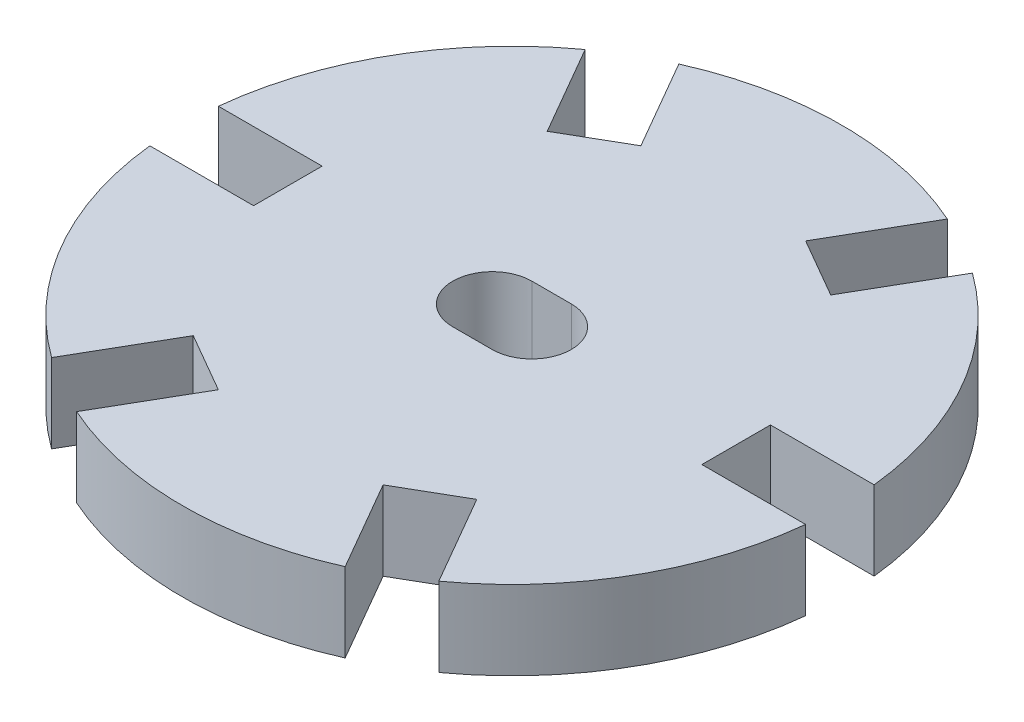
ISO-10303-21;
HEADER;
FILE_DESCRIPTION(('STEP AP214'),'2;1');
FILE_NAME('part.step','',(''),(''),'','','');
FILE_SCHEMA(('AUTOMOTIVE_DESIGN { 1 0 10303 214 1 1 1 1 }'));
ENDSEC;
DATA;
#1=APPLICATION_CONTEXT('core data for automotive mechanical design processes');
#2=APPLICATION_PROTOCOL_DEFINITION('international standard','automotive_design',2000,#1);
#3=PRODUCT_CONTEXT('',#1,'mechanical');
#4=PRODUCT('Part','Part','',(#3));
#5=PRODUCT_RELATED_PRODUCT_CATEGORY('part','',(#4));
#6=PRODUCT_DEFINITION_FORMATION('','',#4);
#7=PRODUCT_DEFINITION_CONTEXT('part definition',#1,'design');
#8=PRODUCT_DEFINITION('design','',#6,#7);
#9=PRODUCT_DEFINITION_SHAPE('','',#8);
#10=(LENGTH_UNIT() NAMED_UNIT(*) SI_UNIT(.MILLI.,.METRE.));
#11=(NAMED_UNIT(*) PLANE_ANGLE_UNIT() SI_UNIT($,.RADIAN.));
#12=(NAMED_UNIT(*) SI_UNIT($,.STERADIAN.) SOLID_ANGLE_UNIT());
#13=UNCERTAINTY_MEASURE_WITH_UNIT(LENGTH_MEASURE(1.E-05),#10,'distance_accuracy_value','');
#14=(GEOMETRIC_REPRESENTATION_CONTEXT(3) GLOBAL_UNCERTAINTY_ASSIGNED_CONTEXT((#13)) GLOBAL_UNIT_ASSIGNED_CONTEXT((#10,
#11,#12)) REPRESENTATION_CONTEXT('',''));
#15=CARTESIAN_POINT('',(0.,0.,0.));
#16=DIRECTION('',(0.,0.,1.));
#17=DIRECTION('',(1.,0.,0.));
#18=AXIS2_PLACEMENT_3D('',#15,#16,#17);
#19=CARTESIAN_POINT('',(0.,-1.5,0.));
#20=DIRECTION('',(0.,1.,0.));
#21=DIRECTION('',(0.,0.,1.));
#22=AXIS2_PLACEMENT_3D('',#19,#20,#21);
#23=CYLINDRICAL_SURFACE('',#22,12.5);
#24=DIRECTION('',(0.,1.,0.));
#25=VECTOR('',#24,1.);
#26=CARTESIAN_POINT('',(5.09027508224825,-1.5,-11.4166150669558));
#27=LINE('',#26,#25);
#28=CARTESIAN_POINT('',(5.09027508224826,-1.5,-11.4166150669558));
#29=VERTEX_POINT('',#28);
#30=CARTESIAN_POINT('',(5.09027508224826,1.5,-11.4166150669558));
#31=VERTEX_POINT('',#30);
#32=EDGE_CURVE('E401',#29,#31,#27,.T.);
#33=ORIENTED_EDGE('',*,*,#32,.F.);
#34=CARTESIAN_POINT('',(0.,-1.5,0.));
#35=DIRECTION('',(0.,1.,0.));
#36=DIRECTION('',(0.,0.,1.));
#37=AXIS2_PLACEMENT_3D('',#34,#35,#36);
#38=CIRCLE('',#37,12.5);
#39=CARTESIAN_POINT('',(-5.09027508224825,-1.5,-11.4166150669558));
#40=VERTEX_POINT('',#39);
#41=EDGE_CURVE('E443',#29,#40,#38,.T.);
#42=ORIENTED_EDGE('',*,*,#41,.T.);
#43=DIRECTION('',(0.,1.,0.));
#44=VECTOR('',#43,1.);
#45=CARTESIAN_POINT('',(-5.09027508224825,-1.5,-11.4166150669558));
#46=LINE('',#45,#44);
#47=CARTESIAN_POINT('',(-5.09027508224825,1.5,-11.4166150669558));
#48=VERTEX_POINT('',#47);
#49=EDGE_CURVE('E395',#48,#40,#46,.F.);
#50=ORIENTED_EDGE('',*,*,#49,.F.);
#51=CARTESIAN_POINT('',(0.,1.5,0.));
#52=DIRECTION('',(0.,1.,0.));
#53=DIRECTION('',(0.,0.,1.));
#54=AXIS2_PLACEMENT_3D('',#51,#52,#53);
#55=CIRCLE('',#54,12.5);
#56=EDGE_CURVE('E434',#31,#48,#55,.T.);
#57=ORIENTED_EDGE('',*,*,#56,.F.);
#58=EDGE_LOOP('',(#33,#42,#50,#57));
#59=FACE_BOUND('',#58,.T.);
#60=ADVANCED_FACE('F45',(#59),#23,.T.);
#61=DIRECTION('',(0.,1.,0.));
#62=VECTOR('',#61,1.);
#63=CARTESIAN_POINT('',(-7.34194113208779,-1.5,-10.1166150669558));
#64=LINE('',#63,#62);
#65=CARTESIAN_POINT('',(-7.34194113208779,-1.5,-10.1166150669558));
#66=VERTEX_POINT('',#65);
#67=CARTESIAN_POINT('',(-7.34194113208779,1.5,-10.1166150669558));
#68=VERTEX_POINT('',#67);
#69=EDGE_CURVE('E397',#66,#68,#64,.T.);
#70=ORIENTED_EDGE('',*,*,#69,.F.);
#71=CARTESIAN_POINT('',(-12.432216214336,-1.5,-1.3));
#72=VERTEX_POINT('',#71);
#73=EDGE_CURVE('E446',#66,#72,#38,.T.);
#74=ORIENTED_EDGE('',*,*,#73,.T.);
#75=DIRECTION('',(0.,1.,0.));
#76=VECTOR('',#75,1.);
#77=CARTESIAN_POINT('',(-12.432216214336,-1.5,-1.3));
#78=LINE('',#77,#76);
#79=CARTESIAN_POINT('',(-12.432216214336,1.5,-1.3));
#80=VERTEX_POINT('',#79);
#81=EDGE_CURVE('E391',#80,#72,#78,.F.);
#82=ORIENTED_EDGE('',*,*,#81,.F.);
#83=EDGE_CURVE('E470',#68,#80,#55,.T.);
#84=ORIENTED_EDGE('',*,*,#83,.F.);
#85=EDGE_LOOP('',(#70,#74,#82,#84));
#86=FACE_BOUND('',#85,.T.);
#87=ADVANCED_FACE('F520',(#86),#23,.T.);
#88=DIRECTION('',(0.,1.,0.));
#89=VECTOR('',#88,1.);
#90=CARTESIAN_POINT('',(-12.432216214336,-1.5,1.3));
#91=LINE('',#90,#89);
#92=CARTESIAN_POINT('',(-12.432216214336,-1.5,1.3));
#93=VERTEX_POINT('',#92);
#94=CARTESIAN_POINT('',(-12.432216214336,1.5,1.3));
#95=VERTEX_POINT('',#94);
#96=EDGE_CURVE('E393',#93,#95,#91,.T.);
#97=ORIENTED_EDGE('',*,*,#96,.F.);
#98=CARTESIAN_POINT('',(-7.3419411320878,-1.5,10.1166150669558));
#99=VERTEX_POINT('',#98);
#100=EDGE_CURVE('E411',#93,#99,#38,.T.);
#101=ORIENTED_EDGE('',*,*,#100,.T.);
#102=DIRECTION('',(0.,1.,0.));
#103=VECTOR('',#102,1.);
#104=CARTESIAN_POINT('',(-7.3419411320878,-1.5,10.1166150669558));
#105=LINE('',#104,#103);
#106=CARTESIAN_POINT('',(-7.3419411320878,1.5,10.1166150669558));
#107=VERTEX_POINT('',#106);
#108=EDGE_CURVE('E387',#107,#99,#105,.F.);
#109=ORIENTED_EDGE('',*,*,#108,.F.);
#110=EDGE_CURVE('E406',#95,#107,#55,.T.);
#111=ORIENTED_EDGE('',*,*,#110,.F.);
#112=EDGE_LOOP('',(#97,#101,#109,#111));
#113=FACE_BOUND('',#112,.T.);
#114=ADVANCED_FACE('F457',(#113),#23,.T.);
#115=DIRECTION('',(0.,1.,0.));
#116=VECTOR('',#115,1.);
#117=CARTESIAN_POINT('',(-5.09027508224826,-1.5,11.4166150669558));
#118=LINE('',#117,#116);
#119=CARTESIAN_POINT('',(-5.09027508224826,-1.5,11.4166150669558));
#120=VERTEX_POINT('',#119);
#121=CARTESIAN_POINT('',(-5.09027508224826,1.5,11.4166150669558));
#122=VERTEX_POINT('',#121);
#123=EDGE_CURVE('E389',#120,#122,#118,.T.);
#124=ORIENTED_EDGE('',*,*,#123,.F.);
#125=CARTESIAN_POINT('',(5.09027508224824,-1.5,11.4166150669558));
#126=VERTEX_POINT('',#125);
#127=EDGE_CURVE('E408',#120,#126,#38,.T.);
#128=ORIENTED_EDGE('',*,*,#127,.T.);
#129=DIRECTION('',(0.,1.,0.));
#130=VECTOR('',#129,1.);
#131=CARTESIAN_POINT('',(5.09027508224824,-1.5,11.4166150669558));
#132=LINE('',#131,#130);
#133=CARTESIAN_POINT('',(5.09027508224824,1.5,11.4166150669558));
#134=VERTEX_POINT('',#133);
#135=EDGE_CURVE('E383',#134,#126,#132,.F.);
#136=ORIENTED_EDGE('',*,*,#135,.F.);
#137=EDGE_CURVE('E403',#122,#134,#55,.T.);
#138=ORIENTED_EDGE('',*,*,#137,.F.);
#139=EDGE_LOOP('',(#124,#128,#136,#138));
#140=FACE_BOUND('',#139,.T.);
#141=ADVANCED_FACE('F530',(#140),#23,.T.);
#142=DIRECTION('',(0.,1.,0.));
#143=VECTOR('',#142,1.);
#144=CARTESIAN_POINT('',(7.34194113208778,-1.5,10.1166150669558));
#145=LINE('',#144,#143);
#146=CARTESIAN_POINT('',(7.34194113208778,-1.5,10.1166150669558));
#147=VERTEX_POINT('',#146);
#148=CARTESIAN_POINT('',(7.34194113208778,1.5,10.1166150669558));
#149=VERTEX_POINT('',#148);
#150=EDGE_CURVE('E385',#147,#149,#145,.T.);
#151=ORIENTED_EDGE('',*,*,#150,.F.);
#152=CARTESIAN_POINT('',(12.432216214336,-1.5,1.3));
#153=VERTEX_POINT('',#152);
#154=EDGE_CURVE('E412',#147,#153,#38,.T.);
#155=ORIENTED_EDGE('',*,*,#154,.T.);
#156=DIRECTION('',(0.,1.,0.));
#157=VECTOR('',#156,1.);
#158=CARTESIAN_POINT('',(12.432216214336,-1.5,1.3));
#159=LINE('',#158,#157);
#160=CARTESIAN_POINT('',(12.432216214336,1.5,1.3));
#161=VERTEX_POINT('',#160);
#162=EDGE_CURVE('E377',#161,#153,#159,.F.);
#163=ORIENTED_EDGE('',*,*,#162,.F.);
#164=EDGE_CURVE('E407',#149,#161,#55,.T.);
#165=ORIENTED_EDGE('',*,*,#164,.F.);
#166=EDGE_LOOP('',(#151,#155,#163,#165));
#167=FACE_BOUND('',#166,.T.);
#168=ADVANCED_FACE('F486',(#167),#23,.T.);
#169=DIRECTION('',(0.,1.,0.));
#170=VECTOR('',#169,1.);
#171=CARTESIAN_POINT('',(7.3419411320878,-1.5,-10.1166150669558));
#172=LINE('',#171,#170);
#173=CARTESIAN_POINT('',(7.34194113208779,1.5,-10.1166150669558));
#174=VERTEX_POINT('',#173);
#175=CARTESIAN_POINT('',(7.34194113208779,-1.5,-10.1166150669558));
#176=VERTEX_POINT('',#175);
#177=EDGE_CURVE('E399',#174,#176,#172,.F.);
#178=ORIENTED_EDGE('',*,*,#177,.F.);
#179=CARTESIAN_POINT('',(12.432216214336,1.5,-1.3));
#180=VERTEX_POINT('',#179);
#181=EDGE_CURVE('E472',#180,#174,#55,.T.);
#182=ORIENTED_EDGE('',*,*,#181,.F.);
#183=DIRECTION('',(0.,1.,0.));
#184=VECTOR('',#183,1.);
#185=CARTESIAN_POINT('',(12.432216214336,-1.5,-1.3));
#186=LINE('',#185,#184);
#187=CARTESIAN_POINT('',(12.432216214336,-1.5,-1.3));
#188=VERTEX_POINT('',#187);
#189=EDGE_CURVE('E381',#188,#180,#186,.T.);
#190=ORIENTED_EDGE('',*,*,#189,.F.);
#191=EDGE_CURVE('E445',#188,#176,#38,.T.);
#192=ORIENTED_EDGE('',*,*,#191,.T.);
#193=EDGE_LOOP('',(#178,#182,#190,#192));
#194=FACE_BOUND('',#193,.T.);
#195=ADVANCED_FACE('F47',(#194),#23,.T.);
#196=CARTESIAN_POINT('',(0.,-1.5,0.));
#197=DIRECTION('',(0.,1.,0.));
#198=DIRECTION('',(0.,0.,1.));
#199=AXIS2_PLACEMENT_3D('',#196,#197,#198);
#200=PLANE('',#199);
#201=DIRECTION('',(-1.,0.,0.));
#202=VECTOR('',#201,1.);
#203=CARTESIAN_POINT('',(-0.746821453546973,-1.5,-1.5));
#204=LINE('',#203,#202);
#205=CARTESIAN_POINT('',(0.746821453546972,-1.5,-1.5));
#206=VERTEX_POINT('',#205);
#207=CARTESIAN_POINT('',(-0.746821453546973,-1.5,-1.5));
#208=VERTEX_POINT('',#207);
#209=EDGE_CURVE('E258',#206,#208,#204,.T.);
#210=ORIENTED_EDGE('',*,*,#209,.T.);
#211=CARTESIAN_POINT('',(-0.746821453546973,-1.5,0.));
#212=DIRECTION('',(0.,1.,0.));
#213=DIRECTION('',(0.,0.,1.));
#214=AXIS2_PLACEMENT_3D('',#211,#212,#213);
#215=CIRCLE('',#214,1.5);
#216=CARTESIAN_POINT('',(-0.746821453546973,-1.5,1.5));
#217=VERTEX_POINT('',#216);
#218=EDGE_CURVE('E249',#208,#217,#215,.T.);
#219=ORIENTED_EDGE('',*,*,#218,.T.);
#220=DIRECTION('',(1.,0.,0.));
#221=VECTOR('',#220,1.);
#222=CARTESIAN_POINT('',(-0.746821453546973,-1.5,1.5));
#223=LINE('',#222,#221);
#224=CARTESIAN_POINT('',(0.746821453546974,-1.5,1.5));
#225=VERTEX_POINT('',#224);
#226=EDGE_CURVE('E255',#217,#225,#223,.T.);
#227=ORIENTED_EDGE('',*,*,#226,.T.);
#228=CARTESIAN_POINT('',(0.746821453546973,-1.5,0.));
#229=DIRECTION('',(0.,1.,0.));
#230=DIRECTION('',(0.,0.,1.));
#231=AXIS2_PLACEMENT_3D('',#228,#229,#230);
#232=CIRCLE('',#231,1.5);
#233=EDGE_CURVE('E60',#225,#206,#232,.T.);
#234=ORIENTED_EDGE('',*,*,#233,.T.);
#235=EDGE_LOOP('',(#210,#219,#227,#234));
#236=FACE_BOUND('',#235,.T.);
#237=ORIENTED_EDGE('',*,*,#41,.F.);
#238=DIRECTION('',(-0.5,0.,0.866025403784439));
#239=VECTOR('',#238,1.);
#240=CARTESIAN_POINT('',(7.12416697508023,-1.5,-14.9394191624432));
#241=LINE('',#240,#239);
#242=CARTESIAN_POINT('',(3.12416697508023,-1.5,-8.01121593216773));
#243=VERTEX_POINT('',#242);
#244=EDGE_CURVE('E292',#29,#243,#241,.T.);
#245=ORIENTED_EDGE('',*,*,#244,.T.);
#246=DIRECTION('',(0.866025403784438,0.,0.5));
#247=VECTOR('',#246,1.);
#248=CARTESIAN_POINT('',(5.37583302491977,-1.5,-6.71121593216773));
#249=LINE('',#248,#247);
#250=CARTESIAN_POINT('',(5.37583302491977,-1.5,-6.71121593216773));
#251=VERTEX_POINT('',#250);
#252=EDGE_CURVE('E285',#243,#251,#249,.T.);
#253=ORIENTED_EDGE('',*,*,#252,.T.);
#254=DIRECTION('',(0.5,0.,-0.866025403784439));
#255=VECTOR('',#254,1.);
#256=CARTESIAN_POINT('',(9.37583302491977,-1.5,-13.6394191624432));
#257=LINE('',#256,#255);
#258=EDGE_CURVE('E288',#251,#176,#257,.T.);
#259=ORIENTED_EDGE('',*,*,#258,.T.);
#260=ORIENTED_EDGE('',*,*,#191,.F.);
#261=DIRECTION('',(-1.,0.,0.));
#262=VECTOR('',#261,1.);
#263=CARTESIAN_POINT('',(16.5,-1.5,-1.3));
#264=LINE('',#263,#262);
#265=CARTESIAN_POINT('',(8.5,-1.5,-1.3));
#266=VERTEX_POINT('',#265);
#267=EDGE_CURVE('E368',#188,#266,#264,.T.);
#268=ORIENTED_EDGE('',*,*,#267,.T.);
#269=DIRECTION('',(0.,0.,1.));
#270=VECTOR('',#269,1.);
#271=CARTESIAN_POINT('',(8.5,-1.5,1.3));
#272=LINE('',#271,#270);
#273=CARTESIAN_POINT('',(8.5,-1.5,1.3));
#274=VERTEX_POINT('',#273);
#275=EDGE_CURVE('E361',#266,#274,#272,.T.);
#276=ORIENTED_EDGE('',*,*,#275,.T.);
#277=DIRECTION('',(1.,0.,0.));
#278=VECTOR('',#277,1.);
#279=CARTESIAN_POINT('',(16.5,-1.5,1.3));
#280=LINE('',#279,#278);
#281=EDGE_CURVE('E364',#274,#153,#280,.T.);
#282=ORIENTED_EDGE('',*,*,#281,.T.);
#283=ORIENTED_EDGE('',*,*,#154,.F.);
#284=DIRECTION('',(-0.5,0.,-0.866025403784439));
#285=VECTOR('',#284,1.);
#286=CARTESIAN_POINT('',(9.37583302491976,-1.5,13.6394191624432));
#287=LINE('',#286,#285);
#288=CARTESIAN_POINT('',(5.37583302491976,-1.5,6.71121593216773));
#289=VERTEX_POINT('',#288);
#290=EDGE_CURVE('E273',#147,#289,#287,.T.);
#291=ORIENTED_EDGE('',*,*,#290,.T.);
#292=DIRECTION('',(-0.866025403784439,0.,0.499999999999999));
#293=VECTOR('',#292,1.);
#294=CARTESIAN_POINT('',(3.12416697508022,-1.5,8.01121593216773));
#295=LINE('',#294,#293);
#296=CARTESIAN_POINT('',(3.12416697508022,-1.5,8.01121593216773));
#297=VERTEX_POINT('',#296);
#298=EDGE_CURVE('E266',#289,#297,#295,.T.);
#299=ORIENTED_EDGE('',*,*,#298,.T.);
#300=DIRECTION('',(0.5,0.,0.866025403784439));
#301=VECTOR('',#300,1.);
#302=CARTESIAN_POINT('',(7.12416697508022,-1.5,14.9394191624432));
#303=LINE('',#302,#301);
#304=EDGE_CURVE('E269',#297,#126,#303,.T.);
#305=ORIENTED_EDGE('',*,*,#304,.T.);
#306=ORIENTED_EDGE('',*,*,#127,.F.);
#307=DIRECTION('',(0.5,0.,-0.866025403784438));
#308=VECTOR('',#307,1.);
#309=CARTESIAN_POINT('',(-7.12416697508024,-1.5,14.9394191624432));
#310=LINE('',#309,#308);
#311=CARTESIAN_POINT('',(-3.12416697508023,-1.5,8.01121593216773));
#312=VERTEX_POINT('',#311);
#313=EDGE_CURVE('E351',#120,#312,#310,.T.);
#314=ORIENTED_EDGE('',*,*,#313,.T.);
#315=DIRECTION('',(-0.866025403784438,0.,-0.500000000000001));
#316=VECTOR('',#315,1.);
#317=CARTESIAN_POINT('',(-5.37583302491977,-1.5,6.71121593216773));
#318=LINE('',#317,#316);
#319=CARTESIAN_POINT('',(-5.37583302491977,-1.5,6.71121593216773));
#320=VERTEX_POINT('',#319);
#321=EDGE_CURVE('E344',#312,#320,#318,.T.);
#322=ORIENTED_EDGE('',*,*,#321,.T.);
#323=DIRECTION('',(-0.5,0.,0.866025403784438));
#324=VECTOR('',#323,1.);
#325=CARTESIAN_POINT('',(-9.37583302491978,-1.5,13.6394191624432));
#326=LINE('',#325,#324);
#327=EDGE_CURVE('E347',#320,#99,#326,.T.);
#328=ORIENTED_EDGE('',*,*,#327,.T.);
#329=ORIENTED_EDGE('',*,*,#100,.F.);
#330=DIRECTION('',(1.,0.,0.));
#331=VECTOR('',#330,1.);
#332=CARTESIAN_POINT('',(-16.5,-1.5,1.3));
#333=LINE('',#332,#331);
#334=CARTESIAN_POINT('',(-8.5,-1.5,1.3));
#335=VERTEX_POINT('',#334);
#336=EDGE_CURVE('E332',#93,#335,#333,.T.);
#337=ORIENTED_EDGE('',*,*,#336,.T.);
#338=DIRECTION('',(0.,0.,-1.));
#339=VECTOR('',#338,1.);
#340=CARTESIAN_POINT('',(-8.5,-1.5,-1.3));
#341=LINE('',#340,#339);
#342=CARTESIAN_POINT('',(-8.5,-1.5,-1.3));
#343=VERTEX_POINT('',#342);
#344=EDGE_CURVE('E325',#335,#343,#341,.T.);
#345=ORIENTED_EDGE('',*,*,#344,.T.);
#346=DIRECTION('',(-1.,0.,0.));
#347=VECTOR('',#346,1.);
#348=CARTESIAN_POINT('',(-16.5,-1.5,-1.3));
#349=LINE('',#348,#347);
#350=EDGE_CURVE('E328',#343,#72,#349,.T.);
#351=ORIENTED_EDGE('',*,*,#350,.T.);
#352=ORIENTED_EDGE('',*,*,#73,.F.);
#353=DIRECTION('',(0.5,0.,0.866025403784439));
#354=VECTOR('',#353,1.);
#355=CARTESIAN_POINT('',(-9.37583302491977,-1.5,-13.6394191624432));
#356=LINE('',#355,#354);
#357=CARTESIAN_POINT('',(-5.37583302491977,-1.5,-6.71121593216773));
#358=VERTEX_POINT('',#357);
#359=EDGE_CURVE('E313',#66,#358,#356,.T.);
#360=ORIENTED_EDGE('',*,*,#359,.T.);
#361=DIRECTION('',(0.866025403784439,0.,-0.5));
#362=VECTOR('',#361,1.);
#363=CARTESIAN_POINT('',(-3.12416697508023,-1.5,-8.01121593216773));
#364=LINE('',#363,#362);
#365=CARTESIAN_POINT('',(-3.12416697508023,-1.5,-8.01121593216773));
#366=VERTEX_POINT('',#365);
#367=EDGE_CURVE('E306',#358,#366,#364,.T.);
#368=ORIENTED_EDGE('',*,*,#367,.T.);
#369=DIRECTION('',(-0.5,0.,-0.866025403784439));
#370=VECTOR('',#369,1.);
#371=CARTESIAN_POINT('',(-7.12416697508023,-1.5,-14.9394191624432));
#372=LINE('',#371,#370);
#373=EDGE_CURVE('E309',#366,#40,#372,.T.);
#374=ORIENTED_EDGE('',*,*,#373,.T.);
#375=EDGE_LOOP('',(#237,#245,#253,#259,#260,#268,#276,#282,#283,#291,#299,#305,#306,#314,#322,
#328,#329,#337,#345,#351,#352,#360,#368,#374));
#376=FACE_BOUND('',#375,.T.);
#377=ADVANCED_FACE('F460',(#236,#376),#200,.F.);
#378=CARTESIAN_POINT('',(0.,1.5,0.));
#379=DIRECTION('',(0.,1.,0.));
#380=DIRECTION('',(0.,0.,1.));
#381=AXIS2_PLACEMENT_3D('',#378,#379,#380);
#382=PLANE('',#381);
#383=CARTESIAN_POINT('',(-0.746821453546973,1.5,0.));
#384=DIRECTION('',(0.,1.,0.));
#385=DIRECTION('',(0.,0.,1.));
#386=AXIS2_PLACEMENT_3D('',#383,#384,#385);
#387=CIRCLE('',#386,1.5);
#388=CARTESIAN_POINT('',(-0.746821453546973,1.5,-1.5));
#389=VERTEX_POINT('',#388);
#390=CARTESIAN_POINT('',(-0.746821453546973,1.5,1.5));
#391=VERTEX_POINT('',#390);
#392=EDGE_CURVE('E68',#389,#391,#387,.T.);
#393=ORIENTED_EDGE('',*,*,#392,.F.);
#394=DIRECTION('',(-1.,0.,0.));
#395=VECTOR('',#394,1.);
#396=CARTESIAN_POINT('',(-0.746821453546973,1.5,-1.5));
#397=LINE('',#396,#395);
#398=CARTESIAN_POINT('',(0.746821453546972,1.5,-1.5));
#399=VERTEX_POINT('',#398);
#400=EDGE_CURVE('E247',#399,#389,#397,.T.);
#401=ORIENTED_EDGE('',*,*,#400,.F.);
#402=CARTESIAN_POINT('',(0.746821453546973,1.5,0.));
#403=DIRECTION('',(0.,1.,0.));
#404=DIRECTION('',(0.,0.,1.));
#405=AXIS2_PLACEMENT_3D('',#402,#403,#404);
#406=CIRCLE('',#405,1.5);
#407=CARTESIAN_POINT('',(0.746821453546974,1.5,1.5));
#408=VERTEX_POINT('',#407);
#409=EDGE_CURVE('E231',#408,#399,#406,.T.);
#410=ORIENTED_EDGE('',*,*,#409,.F.);
#411=DIRECTION('',(1.,0.,0.));
#412=VECTOR('',#411,1.);
#413=CARTESIAN_POINT('',(-0.746821453546973,1.5,1.5));
#414=LINE('',#413,#412);
#415=EDGE_CURVE('E240',#391,#408,#414,.T.);
#416=ORIENTED_EDGE('',*,*,#415,.F.);
#417=EDGE_LOOP('',(#393,#401,#410,#416));
#418=FACE_BOUND('',#417,.T.);
#419=DIRECTION('',(-0.5,0.,0.866025403784439));
#420=VECTOR('',#419,1.);
#421=CARTESIAN_POINT('',(-1.12583302491977,1.5,-0.649999999999998));
#422=LINE('',#421,#420);
#423=CARTESIAN_POINT('',(3.12416697508023,1.5,-8.01121593216773));
#424=VERTEX_POINT('',#423);
#425=EDGE_CURVE('E13',#31,#424,#422,.T.);
#426=ORIENTED_EDGE('',*,*,#425,.F.);
#427=ORIENTED_EDGE('',*,*,#56,.T.);
#428=DIRECTION('',(-0.5,0.,-0.866025403784439));
#429=VECTOR('',#428,1.);
#430=CARTESIAN_POINT('',(-7.12416697508023,1.5,-14.9394191624432));
#431=LINE('',#430,#429);
#432=CARTESIAN_POINT('',(-3.12416697508023,1.5,-8.01121593216773));
#433=VERTEX_POINT('',#432);
#434=EDGE_CURVE('E310',#433,#48,#431,.T.);
#435=ORIENTED_EDGE('',*,*,#434,.F.);
#436=DIRECTION('',(0.866025403784439,0.,-0.5));
#437=VECTOR('',#436,1.);
#438=CARTESIAN_POINT('',(-3.12416697508023,1.5,-8.01121593216773));
#439=LINE('',#438,#437);
#440=CARTESIAN_POINT('',(-5.37583302491977,1.5,-6.71121593216773));
#441=VERTEX_POINT('',#440);
#442=EDGE_CURVE('E317',#441,#433,#439,.T.);
#443=ORIENTED_EDGE('',*,*,#442,.F.);
#444=DIRECTION('',(0.5,0.,0.866025403784439));
#445=VECTOR('',#444,1.);
#446=CARTESIAN_POINT('',(-1.12583302491977,1.5,0.649999999999999));
#447=LINE('',#446,#445);
#448=EDGE_CURVE('E53',#68,#441,#447,.T.);
#449=ORIENTED_EDGE('',*,*,#448,.F.);
#450=ORIENTED_EDGE('',*,*,#83,.T.);
#451=DIRECTION('',(-1.,0.,0.));
#452=VECTOR('',#451,1.);
#453=CARTESIAN_POINT('',(-16.5,1.5,-1.3));
#454=LINE('',#453,#452);
#455=CARTESIAN_POINT('',(-8.5,1.5,-1.3));
#456=VERTEX_POINT('',#455);
#457=EDGE_CURVE('E329',#456,#80,#454,.T.);
#458=ORIENTED_EDGE('',*,*,#457,.F.);
#459=DIRECTION('',(0.,0.,-1.));
#460=VECTOR('',#459,1.);
#461=CARTESIAN_POINT('',(-8.5,1.5,-1.3));
#462=LINE('',#461,#460);
#463=CARTESIAN_POINT('',(-8.5,1.5,1.3));
#464=VERTEX_POINT('',#463);
#465=EDGE_CURVE('E336',#464,#456,#462,.T.);
#466=ORIENTED_EDGE('',*,*,#465,.F.);
#467=DIRECTION('',(1.,0.,0.));
#468=VECTOR('',#467,1.);
#469=CARTESIAN_POINT('',(0.,1.5,1.3));
#470=LINE('',#469,#468);
#471=EDGE_CURVE('E419',#95,#464,#470,.T.);
#472=ORIENTED_EDGE('',*,*,#471,.F.);
#473=ORIENTED_EDGE('',*,*,#110,.T.);
#474=DIRECTION('',(-0.5,0.,0.866025403784438));
#475=VECTOR('',#474,1.);
#476=CARTESIAN_POINT('',(-9.37583302491978,1.5,13.6394191624432));
#477=LINE('',#476,#475);
#478=CARTESIAN_POINT('',(-5.37583302491977,1.5,6.71121593216773));
#479=VERTEX_POINT('',#478);
#480=EDGE_CURVE('E348',#479,#107,#477,.T.);
#481=ORIENTED_EDGE('',*,*,#480,.F.);
#482=DIRECTION('',(-0.866025403784438,0.,-0.500000000000001));
#483=VECTOR('',#482,1.);
#484=CARTESIAN_POINT('',(-5.37583302491977,1.5,6.71121593216773));
#485=LINE('',#484,#483);
#486=CARTESIAN_POINT('',(-3.12416697508023,1.5,8.01121593216773));
#487=VERTEX_POINT('',#486);
#488=EDGE_CURVE('E282',#487,#479,#485,.T.);
#489=ORIENTED_EDGE('',*,*,#488,.F.);
#490=DIRECTION('',(0.5,0.,-0.866025403784439));
#491=VECTOR('',#490,1.);
#492=CARTESIAN_POINT('',(1.12583302491977,1.5,0.65));
#493=LINE('',#492,#491);
#494=EDGE_CURVE('E417',#122,#487,#493,.T.);
#495=ORIENTED_EDGE('',*,*,#494,.F.);
#496=ORIENTED_EDGE('',*,*,#137,.T.);
#497=DIRECTION('',(0.5,0.,0.866025403784439));
#498=VECTOR('',#497,1.);
#499=CARTESIAN_POINT('',(7.12416697508022,1.5,14.9394191624432));
#500=LINE('',#499,#498);
#501=CARTESIAN_POINT('',(3.12416697508022,1.5,8.01121593216773));
#502=VERTEX_POINT('',#501);
#503=EDGE_CURVE('E270',#502,#134,#500,.T.);
#504=ORIENTED_EDGE('',*,*,#503,.F.);
#505=DIRECTION('',(-0.866025403784439,0.,0.499999999999999));
#506=VECTOR('',#505,1.);
#507=CARTESIAN_POINT('',(3.12416697508022,1.5,8.01121593216773));
#508=LINE('',#507,#506);
#509=CARTESIAN_POINT('',(5.37583302491976,1.5,6.71121593216773));
#510=VERTEX_POINT('',#509);
#511=EDGE_CURVE('E263',#510,#502,#508,.T.);
#512=ORIENTED_EDGE('',*,*,#511,.F.);
#513=DIRECTION('',(-0.5,0.,-0.866025403784439));
#514=VECTOR('',#513,1.);
#515=CARTESIAN_POINT('',(1.12583302491977,1.5,-0.649999999999997));
#516=LINE('',#515,#514);
#517=EDGE_CURVE('E415',#149,#510,#516,.T.);
#518=ORIENTED_EDGE('',*,*,#517,.F.);
#519=ORIENTED_EDGE('',*,*,#164,.T.);
#520=DIRECTION('',(1.,0.,0.));
#521=VECTOR('',#520,1.);
#522=CARTESIAN_POINT('',(16.5,1.5,1.3));
#523=LINE('',#522,#521);
#524=CARTESIAN_POINT('',(8.5,1.5,1.3));
#525=VERTEX_POINT('',#524);
#526=EDGE_CURVE('E365',#525,#161,#523,.T.);
#527=ORIENTED_EDGE('',*,*,#526,.F.);
#528=DIRECTION('',(0.,0.,1.));
#529=VECTOR('',#528,1.);
#530=CARTESIAN_POINT('',(8.5,1.5,1.3));
#531=LINE('',#530,#529);
#532=CARTESIAN_POINT('',(8.5,1.5,-1.3));
#533=VERTEX_POINT('',#532);
#534=EDGE_CURVE('E303',#533,#525,#531,.T.);
#535=ORIENTED_EDGE('',*,*,#534,.F.);
#536=DIRECTION('',(-1.,0.,0.));
#537=VECTOR('',#536,1.);
#538=CARTESIAN_POINT('',(0.,1.5,-1.3));
#539=LINE('',#538,#537);
#540=EDGE_CURVE('E413',#180,#533,#539,.T.);
#541=ORIENTED_EDGE('',*,*,#540,.F.);
#542=ORIENTED_EDGE('',*,*,#181,.T.);
#543=DIRECTION('',(0.5,0.,-0.866025403784439));
#544=VECTOR('',#543,1.);
#545=CARTESIAN_POINT('',(9.37583302491977,1.5,-13.6394191624432));
#546=LINE('',#545,#544);
#547=CARTESIAN_POINT('',(5.37583302491977,1.5,-6.71121593216773));
#548=VERTEX_POINT('',#547);
#549=EDGE_CURVE('E289',#548,#174,#546,.T.);
#550=ORIENTED_EDGE('',*,*,#549,.F.);
#551=DIRECTION('',(0.866025403784438,0.,0.5));
#552=VECTOR('',#551,1.);
#553=CARTESIAN_POINT('',(5.37583302491977,1.5,-6.71121593216773));
#554=LINE('',#553,#552);
#555=EDGE_CURVE('E296',#424,#548,#554,.T.);
#556=ORIENTED_EDGE('',*,*,#555,.F.);
#557=EDGE_LOOP('',(#426,#427,#435,#443,#449,#450,#458,#466,#472,#473,#481,#489,#495,#496,#504,
#512,#518,#519,#527,#535,#541,#542,#550,#556));
#558=FACE_BOUND('',#557,.T.);
#559=ADVANCED_FACE('F244',(#418,#558),#382,.T.);
#560=CARTESIAN_POINT('',(8.5,-1.5,1.3));
#561=DIRECTION('',(-1.,0.,0.));
#562=DIRECTION('',(0.,0.,1.));
#563=AXIS2_PLACEMENT_3D('',#560,#561,#562);
#564=PLANE('',#563);
#565=ORIENTED_EDGE('',*,*,#534,.T.);
#566=DIRECTION('',(0.,1.,0.));
#567=VECTOR('',#566,1.);
#568=CARTESIAN_POINT('',(8.5,-1.5,1.3));
#569=LINE('',#568,#567);
#570=EDGE_CURVE('E371',#274,#525,#569,.T.);
#571=ORIENTED_EDGE('',*,*,#570,.F.);
#572=ORIENTED_EDGE('',*,*,#275,.F.);
#573=DIRECTION('',(0.,1.,0.));
#574=VECTOR('',#573,1.);
#575=CARTESIAN_POINT('',(8.5,-1.5,-1.3));
#576=LINE('',#575,#574);
#577=EDGE_CURVE('E374',#266,#533,#576,.T.);
#578=ORIENTED_EDGE('',*,*,#577,.T.);
#579=EDGE_LOOP('',(#565,#571,#572,#578));
#580=FACE_BOUND('',#579,.T.);
#581=ADVANCED_FACE('F495',(#580),#564,.F.);
#582=CARTESIAN_POINT('',(16.5,-1.5,-1.3));
#583=DIRECTION('',(0.,0.,-1.));
#584=DIRECTION('',(-1.,0.,0.));
#585=AXIS2_PLACEMENT_3D('',#582,#583,#584);
#586=PLANE('',#585);
#587=ORIENTED_EDGE('',*,*,#189,.T.);
#588=ORIENTED_EDGE('',*,*,#540,.T.);
#589=ORIENTED_EDGE('',*,*,#577,.F.);
#590=ORIENTED_EDGE('',*,*,#267,.F.);
#591=EDGE_LOOP('',(#587,#588,#589,#590));
#592=FACE_BOUND('',#591,.T.);
#593=ADVANCED_FACE('F562',(#592),#586,.F.);
#594=CARTESIAN_POINT('',(16.5,-1.5,1.3));
#595=DIRECTION('',(0.,0.,1.));
#596=DIRECTION('',(1.,0.,0.));
#597=AXIS2_PLACEMENT_3D('',#594,#595,#596);
#598=PLANE('',#597);
#599=ORIENTED_EDGE('',*,*,#162,.T.);
#600=ORIENTED_EDGE('',*,*,#281,.F.);
#601=ORIENTED_EDGE('',*,*,#570,.T.);
#602=ORIENTED_EDGE('',*,*,#526,.T.);
#603=EDGE_LOOP('',(#599,#600,#601,#602));
#604=FACE_BOUND('',#603,.T.);
#605=ADVANCED_FACE('F491',(#604),#598,.F.);
#606=CARTESIAN_POINT('',(3.12416697508022,-1.5,8.01121593216773));
#607=DIRECTION('',(-0.499999999999999,0.,-0.866025403784439));
#608=DIRECTION('',(-0.866025403784439,0.,0.499999999999999));
#609=AXIS2_PLACEMENT_3D('',#606,#607,#608);
#610=PLANE('',#609);
#611=ORIENTED_EDGE('',*,*,#511,.T.);
#612=DIRECTION('',(0.,1.,0.));
#613=VECTOR('',#612,1.);
#614=CARTESIAN_POINT('',(3.12416697508022,-1.5,8.01121593216773));
#615=LINE('',#614,#613);
#616=EDGE_CURVE('E276',#297,#502,#615,.T.);
#617=ORIENTED_EDGE('',*,*,#616,.F.);
#618=ORIENTED_EDGE('',*,*,#298,.F.);
#619=DIRECTION('',(0.,1.,0.));
#620=VECTOR('',#619,1.);
#621=CARTESIAN_POINT('',(5.37583302491976,-1.5,6.71121593216773));
#622=LINE('',#621,#620);
#623=EDGE_CURVE('E279',#289,#510,#622,.T.);
#624=ORIENTED_EDGE('',*,*,#623,.T.);
#625=EDGE_LOOP('',(#611,#617,#618,#624));
#626=FACE_BOUND('',#625,.T.);
#627=ADVANCED_FACE('F567',(#626),#610,.F.);
#628=CARTESIAN_POINT('',(9.37583302491976,-1.5,13.6394191624432));
#629=DIRECTION('',(0.866025403784439,0.,-0.5));
#630=DIRECTION('',(-0.5,0.,-0.866025403784439));
#631=AXIS2_PLACEMENT_3D('',#628,#629,#630);
#632=PLANE('',#631);
#633=ORIENTED_EDGE('',*,*,#150,.T.);
#634=ORIENTED_EDGE('',*,*,#517,.T.);
#635=ORIENTED_EDGE('',*,*,#623,.F.);
#636=ORIENTED_EDGE('',*,*,#290,.F.);
#637=EDGE_LOOP('',(#633,#634,#635,#636));
#638=FACE_BOUND('',#637,.T.);
#639=ADVANCED_FACE('F558',(#638),#632,.F.);
#640=CARTESIAN_POINT('',(7.12416697508022,-1.5,14.9394191624432));
#641=DIRECTION('',(-0.866025403784439,0.,0.5));
#642=DIRECTION('',(0.5,0.,0.866025403784439));
#643=AXIS2_PLACEMENT_3D('',#640,#641,#642);
#644=PLANE('',#643);
#645=ORIENTED_EDGE('',*,*,#135,.T.);
#646=ORIENTED_EDGE('',*,*,#304,.F.);
#647=ORIENTED_EDGE('',*,*,#616,.T.);
#648=ORIENTED_EDGE('',*,*,#503,.T.);
#649=EDGE_LOOP('',(#645,#646,#647,#648));
#650=FACE_BOUND('',#649,.T.);
#651=ADVANCED_FACE('F546',(#650),#644,.F.);
#652=CARTESIAN_POINT('',(-5.37583302491977,-1.5,6.71121593216773));
#653=DIRECTION('',(0.500000000000001,0.,-0.866025403784438));
#654=DIRECTION('',(-0.866025403784438,0.,-0.500000000000001));
#655=AXIS2_PLACEMENT_3D('',#652,#653,#654);
#656=PLANE('',#655);
#657=ORIENTED_EDGE('',*,*,#488,.T.);
#658=DIRECTION('',(0.,1.,0.));
#659=VECTOR('',#658,1.);
#660=CARTESIAN_POINT('',(-5.37583302491977,-1.5,6.71121593216773));
#661=LINE('',#660,#659);
#662=EDGE_CURVE('E354',#320,#479,#661,.T.);
#663=ORIENTED_EDGE('',*,*,#662,.F.);
#664=ORIENTED_EDGE('',*,*,#321,.F.);
#665=DIRECTION('',(0.,1.,0.));
#666=VECTOR('',#665,1.);
#667=CARTESIAN_POINT('',(-3.12416697508023,-1.5,8.01121593216773));
#668=LINE('',#667,#666);
#669=EDGE_CURVE('E338',#312,#487,#668,.T.);
#670=ORIENTED_EDGE('',*,*,#669,.T.);
#671=EDGE_LOOP('',(#657,#663,#664,#670));
#672=FACE_BOUND('',#671,.T.);
#673=ADVANCED_FACE('F550',(#672),#656,.F.);
#674=CARTESIAN_POINT('',(-7.12416697508024,-1.5,14.9394191624432));
#675=DIRECTION('',(0.866025403784438,0.,0.5));
#676=DIRECTION('',(0.5,0.,-0.866025403784439));
#677=AXIS2_PLACEMENT_3D('',#674,#675,#676);
#678=PLANE('',#677);
#679=ORIENTED_EDGE('',*,*,#123,.T.);
#680=ORIENTED_EDGE('',*,*,#494,.T.);
#681=ORIENTED_EDGE('',*,*,#669,.F.);
#682=ORIENTED_EDGE('',*,*,#313,.F.);
#683=EDGE_LOOP('',(#679,#680,#681,#682));
#684=FACE_BOUND('',#683,.T.);
#685=ADVANCED_FACE('F548',(#684),#678,.F.);
#686=CARTESIAN_POINT('',(-9.37583302491978,-1.5,13.6394191624432));
#687=DIRECTION('',(-0.866025403784439,0.,-0.5));
#688=DIRECTION('',(-0.5,0.,0.866025403784439));
#689=AXIS2_PLACEMENT_3D('',#686,#687,#688);
#690=PLANE('',#689);
#691=ORIENTED_EDGE('',*,*,#108,.T.);
#692=ORIENTED_EDGE('',*,*,#327,.F.);
#693=ORIENTED_EDGE('',*,*,#662,.T.);
#694=ORIENTED_EDGE('',*,*,#480,.T.);
#695=EDGE_LOOP('',(#691,#692,#693,#694));
#696=FACE_BOUND('',#695,.T.);
#697=ADVANCED_FACE('F464',(#696),#690,.F.);
#698=CARTESIAN_POINT('',(-8.5,-1.5,-1.3));
#699=DIRECTION('',(1.,0.,0.));
#700=DIRECTION('',(0.,0.,-1.));
#701=AXIS2_PLACEMENT_3D('',#698,#699,#700);
#702=PLANE('',#701);
#703=ORIENTED_EDGE('',*,*,#465,.T.);
#704=DIRECTION('',(0.,1.,0.));
#705=VECTOR('',#704,1.);
#706=CARTESIAN_POINT('',(-8.5,-1.5,-1.3));
#707=LINE('',#706,#705);
#708=EDGE_CURVE('E335',#343,#456,#707,.T.);
#709=ORIENTED_EDGE('',*,*,#708,.F.);
#710=ORIENTED_EDGE('',*,*,#344,.F.);
#711=DIRECTION('',(0.,1.,0.));
#712=VECTOR('',#711,1.);
#713=CARTESIAN_POINT('',(-8.5,-1.5,1.3));
#714=LINE('',#713,#712);
#715=EDGE_CURVE('E319',#335,#464,#714,.T.);
#716=ORIENTED_EDGE('',*,*,#715,.T.);
#717=EDGE_LOOP('',(#703,#709,#710,#716));
#718=FACE_BOUND('',#717,.T.);
#719=ADVANCED_FACE('F624',(#718),#702,.F.);
#720=CARTESIAN_POINT('',(-16.5,-1.5,1.3));
#721=DIRECTION('',(0.,0.,1.));
#722=DIRECTION('',(1.,0.,0.));
#723=AXIS2_PLACEMENT_3D('',#720,#721,#722);
#724=PLANE('',#723);
#725=ORIENTED_EDGE('',*,*,#96,.T.);
#726=ORIENTED_EDGE('',*,*,#471,.T.);
#727=ORIENTED_EDGE('',*,*,#715,.F.);
#728=ORIENTED_EDGE('',*,*,#336,.F.);
#729=EDGE_LOOP('',(#725,#726,#727,#728));
#730=FACE_BOUND('',#729,.T.);
#731=ADVANCED_FACE('F632',(#730),#724,.F.);
#732=CARTESIAN_POINT('',(-16.5,-1.5,-1.3));
#733=DIRECTION('',(0.,0.,-1.));
#734=DIRECTION('',(-1.,0.,0.));
#735=AXIS2_PLACEMENT_3D('',#732,#733,#734);
#736=PLANE('',#735);
#737=ORIENTED_EDGE('',*,*,#81,.T.);
#738=ORIENTED_EDGE('',*,*,#350,.F.);
#739=ORIENTED_EDGE('',*,*,#708,.T.);
#740=ORIENTED_EDGE('',*,*,#457,.T.);
#741=EDGE_LOOP('',(#737,#738,#739,#740));
#742=FACE_BOUND('',#741,.T.);
#743=ADVANCED_FACE('F642',(#742),#736,.F.);
#744=CARTESIAN_POINT('',(-3.12416697508023,-1.5,-8.01121593216773));
#745=DIRECTION('',(0.5,0.,0.866025403784439));
#746=DIRECTION('',(0.866025403784439,0.,-0.5));
#747=AXIS2_PLACEMENT_3D('',#744,#745,#746);
#748=PLANE('',#747);
#749=ORIENTED_EDGE('',*,*,#442,.T.);
#750=DIRECTION('',(0.,1.,0.));
#751=VECTOR('',#750,1.);
#752=CARTESIAN_POINT('',(-3.12416697508023,-1.5,-8.01121593216773));
#753=LINE('',#752,#751);
#754=EDGE_CURVE('E316',#366,#433,#753,.T.);
#755=ORIENTED_EDGE('',*,*,#754,.F.);
#756=ORIENTED_EDGE('',*,*,#367,.F.);
#757=DIRECTION('',(0.,1.,0.));
#758=VECTOR('',#757,1.);
#759=CARTESIAN_POINT('',(-5.37583302491977,-1.5,-6.71121593216773));
#760=LINE('',#759,#758);
#761=EDGE_CURVE('E298',#358,#441,#760,.T.);
#762=ORIENTED_EDGE('',*,*,#761,.T.);
#763=EDGE_LOOP('',(#749,#755,#756,#762));
#764=FACE_BOUND('',#763,.T.);
#765=ADVANCED_FACE('F429',(#764),#748,.F.);
#766=CARTESIAN_POINT('',(-9.37583302491977,-1.5,-13.6394191624432));
#767=DIRECTION('',(-0.866025403784439,0.,0.5));
#768=DIRECTION('',(0.5,0.,0.866025403784439));
#769=AXIS2_PLACEMENT_3D('',#766,#767,#768);
#770=PLANE('',#769);
#771=ORIENTED_EDGE('',*,*,#69,.T.);
#772=ORIENTED_EDGE('',*,*,#448,.T.);
#773=ORIENTED_EDGE('',*,*,#761,.F.);
#774=ORIENTED_EDGE('',*,*,#359,.F.);
#775=EDGE_LOOP('',(#771,#772,#773,#774));
#776=FACE_BOUND('',#775,.T.);
#777=ADVANCED_FACE('F422',(#776),#770,.F.);
#778=CARTESIAN_POINT('',(-7.12416697508023,-1.5,-14.9394191624432));
#779=DIRECTION('',(0.866025403784439,0.,-0.5));
#780=DIRECTION('',(-0.5,0.,-0.866025403784439));
#781=AXIS2_PLACEMENT_3D('',#778,#779,#780);
#782=PLANE('',#781);
#783=ORIENTED_EDGE('',*,*,#49,.T.);
#784=ORIENTED_EDGE('',*,*,#373,.F.);
#785=ORIENTED_EDGE('',*,*,#754,.T.);
#786=ORIENTED_EDGE('',*,*,#434,.T.);
#787=EDGE_LOOP('',(#783,#784,#785,#786));
#788=FACE_BOUND('',#787,.T.);
#789=ADVANCED_FACE('F437',(#788),#782,.F.);
#790=CARTESIAN_POINT('',(5.37583302491977,-1.5,-6.71121593216773));
#791=DIRECTION('',(-0.5,0.,0.866025403784438));
#792=DIRECTION('',(0.866025403784439,0.,0.5));
#793=AXIS2_PLACEMENT_3D('',#790,#791,#792);
#794=PLANE('',#793);
#795=ORIENTED_EDGE('',*,*,#555,.T.);
#796=DIRECTION('',(0.,1.,0.));
#797=VECTOR('',#796,1.);
#798=CARTESIAN_POINT('',(5.37583302491977,-1.5,-6.71121593216773));
#799=LINE('',#798,#797);
#800=EDGE_CURVE('E295',#251,#548,#799,.T.);
#801=ORIENTED_EDGE('',*,*,#800,.F.);
#802=ORIENTED_EDGE('',*,*,#252,.F.);
#803=DIRECTION('',(0.,1.,0.));
#804=VECTOR('',#803,1.);
#805=CARTESIAN_POINT('',(3.12416697508023,-1.5,-8.01121593216773));
#806=LINE('',#805,#804);
#807=EDGE_CURVE('E300',#243,#424,#806,.T.);
#808=ORIENTED_EDGE('',*,*,#807,.T.);
#809=EDGE_LOOP('',(#795,#801,#802,#808));
#810=FACE_BOUND('',#809,.T.);
#811=ADVANCED_FACE('F505',(#810),#794,.F.);
#812=CARTESIAN_POINT('',(7.12416697508023,-1.5,-14.9394191624432));
#813=DIRECTION('',(-0.866025403784439,0.,-0.5));
#814=DIRECTION('',(-0.5,0.,0.866025403784439));
#815=AXIS2_PLACEMENT_3D('',#812,#813,#814);
#816=PLANE('',#815);
#817=ORIENTED_EDGE('',*,*,#32,.T.);
#818=ORIENTED_EDGE('',*,*,#425,.T.);
#819=ORIENTED_EDGE('',*,*,#807,.F.);
#820=ORIENTED_EDGE('',*,*,#244,.F.);
#821=EDGE_LOOP('',(#817,#818,#819,#820));
#822=FACE_BOUND('',#821,.T.);
#823=ADVANCED_FACE('F508',(#822),#816,.F.);
#824=CARTESIAN_POINT('',(9.37583302491977,-1.5,-13.6394191624432));
#825=DIRECTION('',(0.866025403784439,0.,0.5));
#826=DIRECTION('',(0.5,0.,-0.866025403784439));
#827=AXIS2_PLACEMENT_3D('',#824,#825,#826);
#828=PLANE('',#827);
#829=ORIENTED_EDGE('',*,*,#177,.T.);
#830=ORIENTED_EDGE('',*,*,#258,.F.);
#831=ORIENTED_EDGE('',*,*,#800,.T.);
#832=ORIENTED_EDGE('',*,*,#549,.T.);
#833=EDGE_LOOP('',(#829,#830,#831,#832));
#834=FACE_BOUND('',#833,.T.);
#835=ADVANCED_FACE('F502',(#834),#828,.F.);
#836=CARTESIAN_POINT('',(-0.746821453546973,-1.5,0.));
#837=DIRECTION('',(0.,1.,0.));
#838=DIRECTION('',(0.,0.,1.));
#839=AXIS2_PLACEMENT_3D('',#836,#837,#838);
#840=CYLINDRICAL_SURFACE('',#839,1.5);
#841=DIRECTION('',(0.,1.,0.));
#842=VECTOR('',#841,1.);
#843=CARTESIAN_POINT('',(-0.746821453546973,-1.5,1.5));
#844=LINE('',#843,#842);
#845=EDGE_CURVE('E237',#217,#391,#844,.T.);
#846=ORIENTED_EDGE('',*,*,#845,.F.);
#847=ORIENTED_EDGE('',*,*,#218,.F.);
#848=DIRECTION('',(0.,1.,0.));
#849=VECTOR('',#848,1.);
#850=CARTESIAN_POINT('',(-0.746821453546973,-1.5,-1.5));
#851=LINE('',#850,#849);
#852=EDGE_CURVE('E261',#208,#389,#851,.T.);
#853=ORIENTED_EDGE('',*,*,#852,.T.);
#854=ORIENTED_EDGE('',*,*,#392,.T.);
#855=EDGE_LOOP('',(#846,#847,#853,#854));
#856=FACE_BOUND('',#855,.T.);
#857=ADVANCED_FACE('F515',(#856),#840,.F.);
#858=CARTESIAN_POINT('',(-0.746821453546973,-1.5,-1.5));
#859=DIRECTION('',(0.,0.,-1.));
#860=DIRECTION('',(-1.,0.,0.));
#861=AXIS2_PLACEMENT_3D('',#858,#859,#860);
#862=PLANE('',#861);
#863=ORIENTED_EDGE('',*,*,#852,.F.);
#864=ORIENTED_EDGE('',*,*,#209,.F.);
#865=DIRECTION('',(0.,1.,0.));
#866=VECTOR('',#865,1.);
#867=CARTESIAN_POINT('',(0.746821453546972,-1.5,-1.5));
#868=LINE('',#867,#866);
#869=EDGE_CURVE('E236',#206,#399,#868,.T.);
#870=ORIENTED_EDGE('',*,*,#869,.T.);
#871=ORIENTED_EDGE('',*,*,#400,.T.);
#872=EDGE_LOOP('',(#863,#864,#870,#871));
#873=FACE_BOUND('',#872,.T.);
#874=ADVANCED_FACE('F744',(#873),#862,.F.);
#875=CARTESIAN_POINT('',(0.746821453546973,-1.5,0.));
#876=DIRECTION('',(0.,1.,0.));
#877=DIRECTION('',(0.,0.,1.));
#878=AXIS2_PLACEMENT_3D('',#875,#876,#877);
#879=CYLINDRICAL_SURFACE('',#878,1.5);
#880=ORIENTED_EDGE('',*,*,#869,.F.);
#881=ORIENTED_EDGE('',*,*,#233,.F.);
#882=DIRECTION('',(0.,1.,0.));
#883=VECTOR('',#882,1.);
#884=CARTESIAN_POINT('',(0.746821453546974,-1.5,1.5));
#885=LINE('',#884,#883);
#886=EDGE_CURVE('E227',#225,#408,#885,.T.);
#887=ORIENTED_EDGE('',*,*,#886,.T.);
#888=ORIENTED_EDGE('',*,*,#409,.T.);
#889=EDGE_LOOP('',(#880,#881,#887,#888));
#890=FACE_BOUND('',#889,.T.);
#891=ADVANCED_FACE('F229',(#890),#879,.F.);
#892=CARTESIAN_POINT('',(-0.746821453546973,-1.5,1.5));
#893=DIRECTION('',(0.,0.,1.));
#894=DIRECTION('',(1.,0.,0.));
#895=AXIS2_PLACEMENT_3D('',#892,#893,#894);
#896=PLANE('',#895);
#897=ORIENTED_EDGE('',*,*,#886,.F.);
#898=ORIENTED_EDGE('',*,*,#226,.F.);
#899=ORIENTED_EDGE('',*,*,#845,.T.);
#900=ORIENTED_EDGE('',*,*,#415,.T.);
#901=EDGE_LOOP('',(#897,#898,#899,#900));
#902=FACE_BOUND('',#901,.T.);
#903=ADVANCED_FACE('F241',(#902),#896,.F.);
#904=CLOSED_SHELL('',(#60,#87,#114,#141,#168,#195,#377,#559,#581,#593,#605,#627,#639,#651,#673,
#685,#697,#719,#731,#743,#765,#777,#789,#811,#823,#835,#857,#874,#891,#903));
#905=MANIFOLD_SOLID_BREP('B2',#904);
#906=ADVANCED_BREP_SHAPE_REPRESENTATION('',(#18,#905),#14);
#907=SHAPE_DEFINITION_REPRESENTATION(#9,#906);
ENDSEC;
END-ISO-10303-21;
